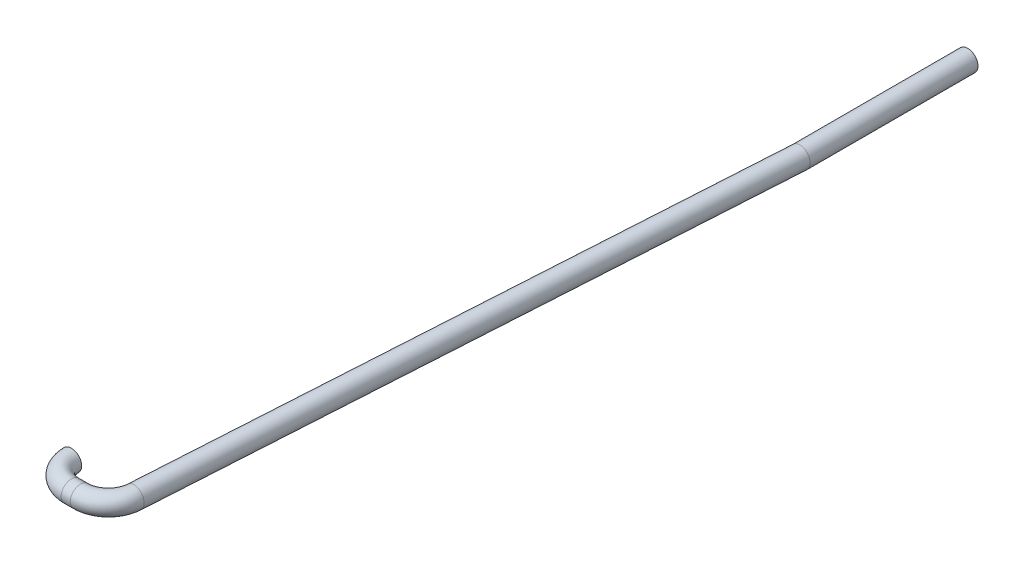
ISO-10303-21;
HEADER;
FILE_DESCRIPTION(('STEP AP214'),'2;1');
FILE_NAME('part.step','',(''),(''),'','','');
FILE_SCHEMA(('AUTOMOTIVE_DESIGN { 1 0 10303 214 1 1 1 1 }'));
ENDSEC;
DATA;
#1=APPLICATION_CONTEXT('core data for automotive mechanical design processes');
#2=APPLICATION_PROTOCOL_DEFINITION('international standard','automotive_design',2000,#1);
#3=PRODUCT_CONTEXT('',#1,'mechanical');
#4=PRODUCT('Part','Part','',(#3));
#5=PRODUCT_RELATED_PRODUCT_CATEGORY('part','',(#4));
#6=PRODUCT_DEFINITION_FORMATION('','',#4);
#7=PRODUCT_DEFINITION_CONTEXT('part definition',#1,'design');
#8=PRODUCT_DEFINITION('design','',#6,#7);
#9=PRODUCT_DEFINITION_SHAPE('','',#8);
#10=(LENGTH_UNIT() NAMED_UNIT(*) SI_UNIT(.MILLI.,.METRE.));
#11=(NAMED_UNIT(*) PLANE_ANGLE_UNIT() SI_UNIT($,.RADIAN.));
#12=(NAMED_UNIT(*) SI_UNIT($,.STERADIAN.) SOLID_ANGLE_UNIT());
#13=UNCERTAINTY_MEASURE_WITH_UNIT(LENGTH_MEASURE(1.E-05),#10,'distance_accuracy_value','');
#14=(GEOMETRIC_REPRESENTATION_CONTEXT(3) GLOBAL_UNCERTAINTY_ASSIGNED_CONTEXT((#13)) GLOBAL_UNIT_ASSIGNED_CONTEXT((#10,
#11,#12)) REPRESENTATION_CONTEXT('',''));
#15=CARTESIAN_POINT('',(0.,0.,0.));
#16=DIRECTION('',(0.,0.,1.));
#17=DIRECTION('',(1.,0.,0.));
#18=AXIS2_PLACEMENT_3D('',#15,#16,#17);
#19=CARTESIAN_POINT('',(-259.047005383793,0.,543.352447854375));
#20=DIRECTION('',(0.,0.,-1.));
#21=DIRECTION('',(-1.,0.,0.));
#22=AXIS2_PLACEMENT_3D('',#19,#20,#21);
#23=PLANE('',#22);
#24=CARTESIAN_POINT('',(-259.047005383793,0.,543.352447854375));
#25=DIRECTION('',(0.,0.,-1.));
#26=DIRECTION('',(-1.,0.,0.));
#27=AXIS2_PLACEMENT_3D('',#24,#25,#26);
#28=CIRCLE('',#27,6.34000000000001);
#29=CARTESIAN_POINT('',(-265.387005383793,0.,543.352447854375));
#30=VERTEX_POINT('',#29);
#31=EDGE_CURVE('E80',#30,#30,#28,.T.);
#32=ORIENTED_EDGE('',*,*,#31,.F.);
#33=EDGE_LOOP('',(#32));
#34=FACE_BOUND('',#33,.T.);
#35=CARTESIAN_POINT('',(-259.047005383793,0.,543.352447854375));
#36=DIRECTION('',(0.,0.,-1.));
#37=DIRECTION('',(-1.,0.,0.));
#38=AXIS2_PLACEMENT_3D('',#35,#36,#37);
#39=CIRCLE('',#38,7.34000000000001);
#40=CARTESIAN_POINT('',(-266.387005383793,0.,543.352447854375));
#41=VERTEX_POINT('',#40);
#42=EDGE_CURVE('E64',#41,#41,#39,.T.);
#43=ORIENTED_EDGE('',*,*,#42,.T.);
#44=EDGE_LOOP('',(#43));
#45=FACE_BOUND('',#44,.T.);
#46=ADVANCED_FACE('F35',(#34,#45),#23,.T.);
#47=CARTESIAN_POINT('',(-186.112466624673,0.,-25.5872406447686));
#48=DIRECTION('',(0.,0.,1.));
#49=DIRECTION('',(1.,0.,0.));
#50=AXIS2_PLACEMENT_3D('',#47,#48,#49);
#51=PLANE('',#50);
#52=CARTESIAN_POINT('',(-186.112466624673,0.,-25.5872406447686));
#53=DIRECTION('',(0.,0.,1.));
#54=DIRECTION('',(1.,0.,0.));
#55=AXIS2_PLACEMENT_3D('',#52,#53,#54);
#56=CIRCLE('',#55,6.34000000000001);
#57=CARTESIAN_POINT('',(-179.772466624673,0.,-25.5872406447685));
#58=VERTEX_POINT('',#57);
#59=EDGE_CURVE('E72',#58,#58,#56,.T.);
#60=ORIENTED_EDGE('',*,*,#59,.T.);
#61=EDGE_LOOP('',(#60));
#62=FACE_BOUND('',#61,.T.);
#63=CARTESIAN_POINT('',(-186.112466624673,0.,-25.5872406447686));
#64=DIRECTION('',(0.,0.,1.));
#65=DIRECTION('',(1.,0.,0.));
#66=AXIS2_PLACEMENT_3D('',#63,#64,#65);
#67=CIRCLE('',#66,7.34000000000001);
#68=CARTESIAN_POINT('',(-178.772466624673,0.,-25.5872406447685));
#69=VERTEX_POINT('',#68);
#70=EDGE_CURVE('E39',#69,#69,#67,.T.);
#71=ORIENTED_EDGE('',*,*,#70,.F.);
#72=EDGE_LOOP('',(#71));
#73=FACE_BOUND('',#72,.T.);
#74=ADVANCED_FACE('F120',(#62,#73),#51,.F.);
#75=CARTESIAN_POINT('',(-186.093353854914,0.,94.1002683319173));
#76=DIRECTION('',(-0.0610485395348499,0.,0.998134798421867));
#77=DIRECTION('',(0.998134798421867,0.,0.0610485395348499));
#78=AXIS2_PLACEMENT_3D('',#75,#76,#77);
#79=CYLINDRICAL_SURFACE('',#78,7.34000000000001);
#80=CARTESIAN_POINT('',(-186.112466624673,0.,94.412759355227));
#81=DIRECTION('',(-0.0305385132098192,0.,0.999533590836713));
#82=DIRECTION('',(0.999533590836713,0.,0.0305385132098179));
#83=AXIS2_PLACEMENT_3D('',#80,#81,#82);
#84=ELLIPSE('',#83,7.34342504072892,7.34000000000001);
#85=CARTESIAN_POINT('',(-178.772466624673,0.,94.6370166378386));
#86=VERTEX_POINT('',#85);
#87=EDGE_CURVE('E10',#86,#86,#84,.F.);
#88=ORIENTED_EDGE('',*,*,#87,.F.);
#89=EDGE_LOOP('',(#88));
#90=FACE_BOUND('',#89,.T.);
#91=CARTESIAN_POINT('',(-213.584309415355,0.,543.573418645072));
#92=DIRECTION('',(0.0610485395348566,0.,-0.998134798421867));
#93=DIRECTION('',(-0.998134798421867,0.,-0.0610485395348566));
#94=AXIS2_PLACEMENT_3D('',#91,#92,#93);
#95=CIRCLE('',#94,7.34000000000001);
#96=CARTESIAN_POINT('',(-206.257999994939,0.,544.021514925258));
#97=VERTEX_POINT('',#96);
#98=EDGE_CURVE('E49',#97,#97,#95,.F.);
#99=ORIENTED_EDGE('',*,*,#98,.F.);
#100=EDGE_LOOP('',(#99));
#101=FACE_BOUND('',#100,.T.);
#102=ADVANCED_FACE('F122',(#90,#101),#79,.T.);
#103=CARTESIAN_POINT('',(-233.547005383793,0.,542.352447854375));
#104=DIRECTION('',(0.,-1.,0.));
#105=DIRECTION('',(0.,0.,-1.));
#106=AXIS2_PLACEMENT_3D('',#103,#104,#105);
#107=TOROIDAL_SURFACE('',#106,20.0000000000002,7.34000000000001);
#108=CARTESIAN_POINT('',(-233.547005383793,0.,562.352447854375));
#109=DIRECTION('',(-1.,0.,0.));
#110=DIRECTION('',(0.,0.,1.));
#111=AXIS2_PLACEMENT_3D('',#108,#109,#110);
#112=CIRCLE('',#111,7.34000000000001);
#113=CARTESIAN_POINT('',(-233.547005383793,0.,569.692447854375));
#114=VERTEX_POINT('',#113);
#115=EDGE_CURVE('E57',#114,#114,#112,.T.);
#116=CARTESIAN_POINT('',(-233.547005383793,0.,542.352447854375));
#117=DIRECTION('',(0.,-1.,0.));
#118=DIRECTION('',(0.,0.,-1.));
#119=AXIS2_PLACEMENT_3D('',#116,#117,#118);
#120=CIRCLE('',#119,27.3400000000002);
#121=EDGE_CURVE('',#97,#114,#120,.T.);
#122=ORIENTED_EDGE('',*,*,#98,.T.);
#123=ORIENTED_EDGE('',*,*,#115,.F.);
#124=ORIENTED_EDGE('',*,*,#121,.T.);
#125=ORIENTED_EDGE('',*,*,#121,.F.);
#126=EDGE_LOOP('',(#122,#124,#123,#125));
#127=FACE_BOUND('',#126,.T.);
#128=ADVANCED_FACE('F129',(#127),#107,.T.);
#129=CARTESIAN_POINT('',(-233.547005383793,0.,562.352447854375));
#130=DIRECTION('',(-1.,0.,0.));
#131=DIRECTION('',(0.,0.,1.));
#132=AXIS2_PLACEMENT_3D('',#129,#130,#131);
#133=CYLINDRICAL_SURFACE('',#132,7.34000000000001);
#134=CARTESIAN_POINT('',(-240.047005383793,0.,562.352447854375));
#135=DIRECTION('',(1.,0.,0.));
#136=DIRECTION('',(0.,0.,-1.));
#137=AXIS2_PLACEMENT_3D('',#134,#135,#136);
#138=CIRCLE('',#137,7.34000000000001);
#139=CARTESIAN_POINT('',(-240.047005383792,0.,569.692447854375));
#140=VERTEX_POINT('',#139);
#141=EDGE_CURVE('E61',#140,#140,#138,.F.);
#142=ORIENTED_EDGE('',*,*,#141,.F.);
#143=EDGE_LOOP('',(#142));
#144=FACE_BOUND('',#143,.T.);
#145=ORIENTED_EDGE('',*,*,#115,.T.);
#146=EDGE_LOOP('',(#145));
#147=FACE_BOUND('',#146,.T.);
#148=ADVANCED_FACE('F116',(#144,#147),#133,.T.);
#149=CARTESIAN_POINT('',(-240.047005383793,0.,543.352447854375));
#150=DIRECTION('',(0.,-1.,0.));
#151=DIRECTION('',(0.,0.,-1.));
#152=AXIS2_PLACEMENT_3D('',#149,#150,#151);
#153=TOROIDAL_SURFACE('',#152,19.,7.34000000000001);
#154=CARTESIAN_POINT('',(-240.047005383793,0.,543.352447854375));
#155=DIRECTION('',(0.,-1.,0.));
#156=DIRECTION('',(0.,0.,-1.));
#157=AXIS2_PLACEMENT_3D('',#154,#155,#156);
#158=CIRCLE('',#157,26.34);
#159=EDGE_CURVE('',#140,#41,#158,.T.);
#160=ORIENTED_EDGE('',*,*,#141,.T.);
#161=ORIENTED_EDGE('',*,*,#42,.F.);
#162=ORIENTED_EDGE('',*,*,#159,.T.);
#163=ORIENTED_EDGE('',*,*,#159,.F.);
#164=EDGE_LOOP('',(#160,#162,#161,#163));
#165=FACE_BOUND('',#164,.T.);
#166=ADVANCED_FACE('F111',(#165),#153,.T.);
#167=CARTESIAN_POINT('',(-186.112466624673,0.,-25.5872406447686));
#168=DIRECTION('',(0.,0.,1.));
#169=DIRECTION('',(1.,0.,0.));
#170=AXIS2_PLACEMENT_3D('',#167,#168,#169);
#171=CYLINDRICAL_SURFACE('',#170,7.34000000000001);
#172=ORIENTED_EDGE('',*,*,#70,.T.);
#173=EDGE_LOOP('',(#172));
#174=FACE_BOUND('',#173,.T.);
#175=ORIENTED_EDGE('',*,*,#87,.T.);
#176=EDGE_LOOP('',(#175));
#177=FACE_BOUND('',#176,.T.);
#178=ADVANCED_FACE('F37',(#174,#177),#171,.T.);
#179=CARTESIAN_POINT('',(-186.093353854914,0.,94.1002683319173));
#180=DIRECTION('',(-0.0610485395348499,0.,0.998134798421867));
#181=DIRECTION('',(0.998134798421867,0.,0.0610485395348499));
#182=AXIS2_PLACEMENT_3D('',#179,#180,#181);
#183=CYLINDRICAL_SURFACE('',#182,6.34000000000001);
#184=CARTESIAN_POINT('',(-186.112466624673,0.,94.4127593552314));
#185=DIRECTION('',(-0.0305385132098192,0.,0.999533590836713));
#186=DIRECTION('',(0.999533590836713,0.,0.0305385132098192));
#187=AXIS2_PLACEMENT_3D('',#184,#185,#186);
#188=ELLIPSE('',#187,6.34295841392662,6.34000000000001);
#189=CARTESIAN_POINT('',(-179.772466624673,0.,94.6064638745444));
#190=VERTEX_POINT('',#189);
#191=EDGE_CURVE('E67',#190,#190,#188,.F.);
#192=ORIENTED_EDGE('',*,*,#191,.T.);
#193=EDGE_LOOP('',(#192));
#194=FACE_BOUND('',#193,.T.);
#195=CARTESIAN_POINT('',(-213.584309415355,0.,543.573418645072));
#196=DIRECTION('',(-0.0610485395348614,0.,0.998134798421867));
#197=DIRECTION('',(0.998134798421867,0.,0.0610485395348614));
#198=AXIS2_PLACEMENT_3D('',#195,#196,#197);
#199=CIRCLE('',#198,6.34000000000001);
#200=CARTESIAN_POINT('',(-207.256134793361,0.,543.960466385723));
#201=VERTEX_POINT('',#200);
#202=EDGE_CURVE('E52',#201,#201,#199,.T.);
#203=ORIENTED_EDGE('',*,*,#202,.T.);
#204=EDGE_LOOP('',(#203));
#205=FACE_BOUND('',#204,.T.);
#206=ADVANCED_FACE('F96',(#194,#205),#183,.F.);
#207=CARTESIAN_POINT('',(-233.547005383793,0.,542.352447854375));
#208=DIRECTION('',(0.,-1.,0.));
#209=DIRECTION('',(0.,0.,-1.));
#210=AXIS2_PLACEMENT_3D('',#207,#208,#209);
#211=TOROIDAL_SURFACE('',#210,20.0000000000002,6.34000000000001);
#212=CARTESIAN_POINT('',(-233.547005383793,0.,562.352447854375));
#213=DIRECTION('',(-1.,0.,0.));
#214=DIRECTION('',(0.,0.,1.));
#215=AXIS2_PLACEMENT_3D('',#212,#213,#214);
#216=CIRCLE('',#215,6.34000000000001);
#217=CARTESIAN_POINT('',(-233.547005383793,0.,568.692447854375));
#218=VERTEX_POINT('',#217);
#219=EDGE_CURVE('E87',#218,#218,#216,.T.);
#220=CARTESIAN_POINT('',(-233.547005383793,0.,542.352447854375));
#221=DIRECTION('',(0.,-1.,0.));
#222=DIRECTION('',(0.,0.,-1.));
#223=AXIS2_PLACEMENT_3D('',#220,#221,#222);
#224=CIRCLE('',#223,26.3400000000002);
#225=EDGE_CURVE('',#201,#218,#224,.T.);
#226=ORIENTED_EDGE('',*,*,#202,.F.);
#227=ORIENTED_EDGE('',*,*,#219,.T.);
#228=ORIENTED_EDGE('',*,*,#225,.T.);
#229=ORIENTED_EDGE('',*,*,#225,.F.);
#230=EDGE_LOOP('',(#226,#228,#227,#229));
#231=FACE_BOUND('',#230,.T.);
#232=ADVANCED_FACE('F98',(#231),#211,.F.);
#233=CARTESIAN_POINT('',(-233.547005383793,0.,562.352447854375));
#234=DIRECTION('',(-1.,0.,0.));
#235=DIRECTION('',(0.,0.,1.));
#236=AXIS2_PLACEMENT_3D('',#233,#234,#235);
#237=CYLINDRICAL_SURFACE('',#236,6.34000000000001);
#238=CARTESIAN_POINT('',(-240.047005383793,0.,562.352447854375));
#239=DIRECTION('',(-1.,0.,0.));
#240=DIRECTION('',(0.,0.,1.));
#241=AXIS2_PLACEMENT_3D('',#238,#239,#240);
#242=CIRCLE('',#241,6.34000000000001);
#243=CARTESIAN_POINT('',(-240.047005383793,0.,568.692447854375));
#244=VERTEX_POINT('',#243);
#245=EDGE_CURVE('E84',#244,#244,#242,.T.);
#246=ORIENTED_EDGE('',*,*,#245,.T.);
#247=EDGE_LOOP('',(#246));
#248=FACE_BOUND('',#247,.T.);
#249=ORIENTED_EDGE('',*,*,#219,.F.);
#250=EDGE_LOOP('',(#249));
#251=FACE_BOUND('',#250,.T.);
#252=ADVANCED_FACE('F100',(#248,#251),#237,.F.);
#253=CARTESIAN_POINT('',(-240.047005383793,0.,543.352447854375));
#254=DIRECTION('',(0.,-1.,0.));
#255=DIRECTION('',(0.,0.,-1.));
#256=AXIS2_PLACEMENT_3D('',#253,#254,#255);
#257=TOROIDAL_SURFACE('',#256,19.,6.34000000000001);
#258=CARTESIAN_POINT('',(-240.047005383793,0.,543.352447854375));
#259=DIRECTION('',(0.,-1.,0.));
#260=DIRECTION('',(0.,0.,-1.));
#261=AXIS2_PLACEMENT_3D('',#258,#259,#260);
#262=CIRCLE('',#261,25.34);
#263=EDGE_CURVE('',#244,#30,#262,.T.);
#264=ORIENTED_EDGE('',*,*,#245,.F.);
#265=ORIENTED_EDGE('',*,*,#31,.T.);
#266=ORIENTED_EDGE('',*,*,#263,.T.);
#267=ORIENTED_EDGE('',*,*,#263,.F.);
#268=EDGE_LOOP('',(#264,#266,#265,#267));
#269=FACE_BOUND('',#268,.T.);
#270=ADVANCED_FACE('F106',(#269),#257,.F.);
#271=CARTESIAN_POINT('',(-186.112466624673,0.,-25.5872406447686));
#272=DIRECTION('',(0.,0.,1.));
#273=DIRECTION('',(1.,0.,0.));
#274=AXIS2_PLACEMENT_3D('',#271,#272,#273);
#275=CYLINDRICAL_SURFACE('',#274,6.34000000000001);
#276=ORIENTED_EDGE('',*,*,#59,.F.);
#277=EDGE_LOOP('',(#276));
#278=FACE_BOUND('',#277,.T.);
#279=ORIENTED_EDGE('',*,*,#191,.F.);
#280=EDGE_LOOP('',(#279));
#281=FACE_BOUND('',#280,.T.);
#282=ADVANCED_FACE('F134',(#278,#281),#275,.F.);
#283=CLOSED_SHELL('',(#46,#74,#102,#128,#148,#166,#178,#206,#232,#252,#270,#282));
#284=MANIFOLD_SOLID_BREP('B2',#283);
#285=ADVANCED_BREP_SHAPE_REPRESENTATION('',(#18,#284),#14);
#286=SHAPE_DEFINITION_REPRESENTATION(#9,#285);
ENDSEC;
END-ISO-10303-21;
